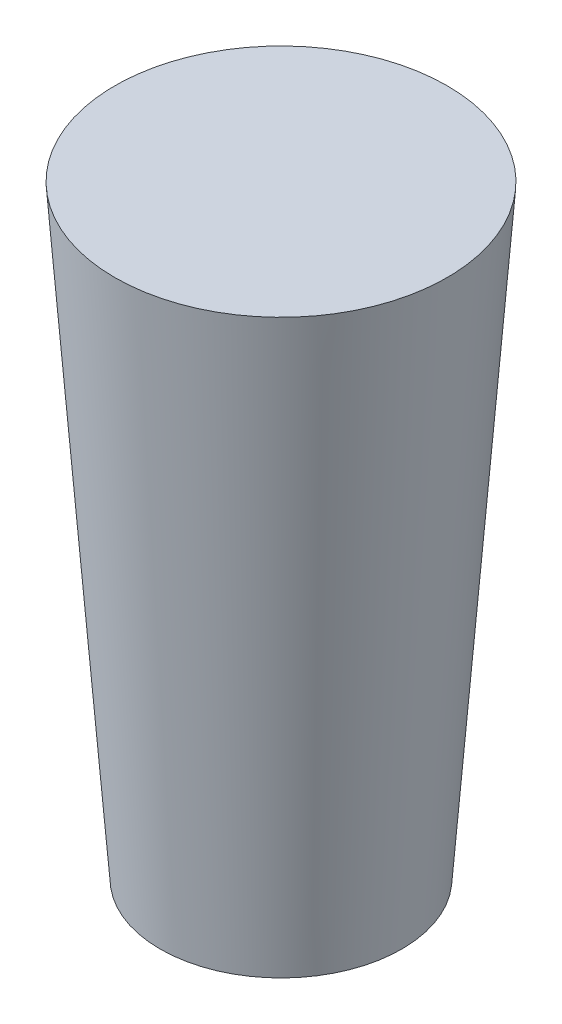
ISO-10303-21;
HEADER;
FILE_DESCRIPTION(('STEP AP214'),'2;1');
FILE_NAME('part.step','',(''),(''),'','','');
FILE_SCHEMA(('AUTOMOTIVE_DESIGN { 1 0 10303 214 1 1 1 1 }'));
ENDSEC;
DATA;
#1=APPLICATION_CONTEXT('core data for automotive mechanical design processes');
#2=APPLICATION_PROTOCOL_DEFINITION('international standard','automotive_design',2000,#1);
#3=PRODUCT_CONTEXT('',#1,'mechanical');
#4=PRODUCT('Part','Part','',(#3));
#5=PRODUCT_RELATED_PRODUCT_CATEGORY('part','',(#4));
#6=PRODUCT_DEFINITION_FORMATION('','',#4);
#7=PRODUCT_DEFINITION_CONTEXT('part definition',#1,'design');
#8=PRODUCT_DEFINITION('design','',#6,#7);
#9=PRODUCT_DEFINITION_SHAPE('','',#8);
#10=(LENGTH_UNIT() NAMED_UNIT(*) SI_UNIT(.MILLI.,.METRE.));
#11=(NAMED_UNIT(*) PLANE_ANGLE_UNIT() SI_UNIT($,.RADIAN.));
#12=(NAMED_UNIT(*) SI_UNIT($,.STERADIAN.) SOLID_ANGLE_UNIT());
#13=UNCERTAINTY_MEASURE_WITH_UNIT(LENGTH_MEASURE(1.E-05),#10,'distance_accuracy_value','');
#14=(GEOMETRIC_REPRESENTATION_CONTEXT(3) GLOBAL_UNCERTAINTY_ASSIGNED_CONTEXT((#13)) GLOBAL_UNIT_ASSIGNED_CONTEXT((#10,
#11,#12)) REPRESENTATION_CONTEXT('',''));
#15=CARTESIAN_POINT('',(0.,0.,0.));
#16=DIRECTION('',(0.,0.,1.));
#17=DIRECTION('',(1.,0.,0.));
#18=AXIS2_PLACEMENT_3D('',#15,#16,#17);
#19=CARTESIAN_POINT('',(3.24364697802198,-5.04464285714285,0.));
#20=DIRECTION('',(0.,-1.,0.));
#21=DIRECTION('',(0.,0.,-1.));
#22=AXIS2_PLACEMENT_3D('',#19,#20,#21);
#23=PLANE('',#22);
#24=CARTESIAN_POINT('',(-0.756353021978021,-5.04464285714285,0.));
#25=DIRECTION('',(0.,1.,0.));
#26=DIRECTION('',(0.,0.,1.));
#27=AXIS2_PLACEMENT_3D('',#24,#25,#26);
#28=CIRCLE('',#27,4.);
#29=CARTESIAN_POINT('',(-0.756353021978021,-5.04464285714285,4.));
#30=VERTEX_POINT('',#29);
#31=EDGE_CURVE('E44',#30,#30,#28,.T.);
#32=ORIENTED_EDGE('',*,*,#31,.F.);
#33=EDGE_LOOP('',(#32));
#34=FACE_BOUND('',#33,.T.);
#35=ADVANCED_FACE('F37',(#34),#23,.T.);
#36=CARTESIAN_POINT('',(-0.756353021978021,14.9553571428571,0.));
#37=DIRECTION('',(0.,1.,0.));
#38=DIRECTION('',(0.,0.,1.));
#39=AXIS2_PLACEMENT_3D('',#36,#37,#38);
#40=PLANE('',#39);
#41=CARTESIAN_POINT('',(-0.756353021978021,14.9553571428571,0.));
#42=DIRECTION('',(0.,1.,0.));
#43=DIRECTION('',(0.,0.,1.));
#44=AXIS2_PLACEMENT_3D('',#41,#42,#43);
#45=CIRCLE('',#44,5.5);
#46=CARTESIAN_POINT('',(-0.756353021978021,14.9553571428571,5.5));
#47=VERTEX_POINT('',#46);
#48=EDGE_CURVE('E10',#47,#47,#45,.T.);
#49=ORIENTED_EDGE('',*,*,#48,.T.);
#50=EDGE_LOOP('',(#49));
#51=FACE_BOUND('',#50,.T.);
#52=ADVANCED_FACE('F55',(#51),#40,.T.);
#53=CARTESIAN_POINT('',(-0.756353021978021,14.9553571428571,0.));
#54=DIRECTION('',(0.,1.,0.));
#55=DIRECTION('',(0.,0.,1.));
#56=AXIS2_PLACEMENT_3D('',#53,#54,#55);
#57=CONICAL_SURFACE('',#56,5.5,0.0748598477107669);
#58=ORIENTED_EDGE('',*,*,#31,.T.);
#59=EDGE_LOOP('',(#58));
#60=FACE_BOUND('',#59,.T.);
#61=ORIENTED_EDGE('',*,*,#48,.F.);
#62=EDGE_LOOP('',(#61));
#63=FACE_BOUND('',#62,.T.);
#64=ADVANCED_FACE('F51',(#60,#63),#57,.T.);
#65=CLOSED_SHELL('',(#35,#52,#64));
#66=MANIFOLD_SOLID_BREP('B2',#65);
#67=ADVANCED_BREP_SHAPE_REPRESENTATION('',(#18,#66),#14);
#68=SHAPE_DEFINITION_REPRESENTATION(#9,#67);
ENDSEC;
END-ISO-10303-21;
